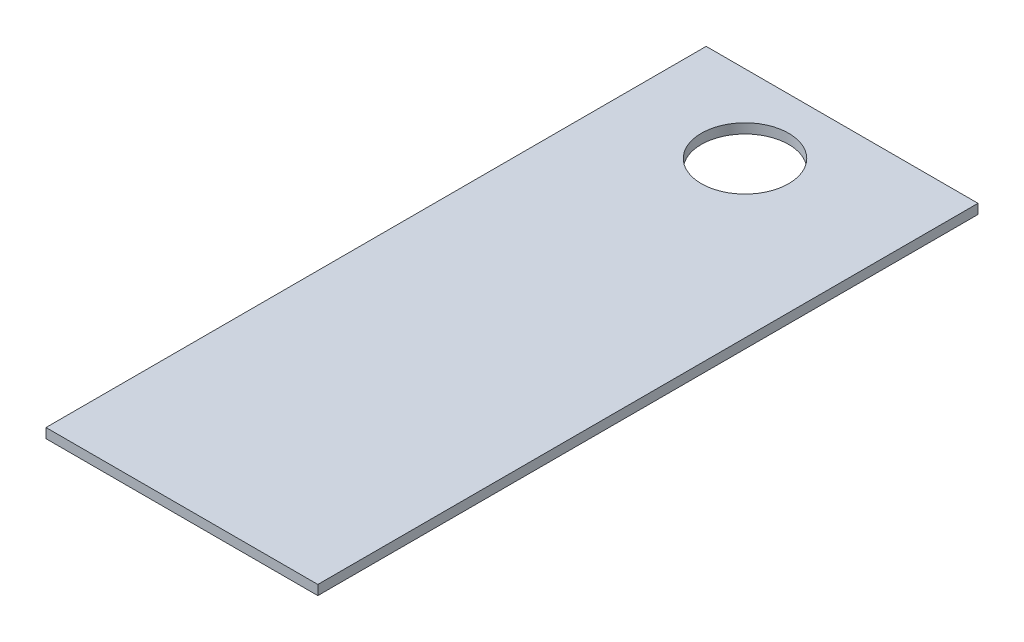
ISO-10303-21;
HEADER;
FILE_DESCRIPTION(('STEP AP214'),'2;1');
FILE_NAME('part.step','',(''),(''),'','','');
FILE_SCHEMA(('AUTOMOTIVE_DESIGN { 1 0 10303 214 1 1 1 1 }'));
ENDSEC;
DATA;
#1=APPLICATION_CONTEXT('core data for automotive mechanical design processes');
#2=APPLICATION_PROTOCOL_DEFINITION('international standard','automotive_design',2000,#1);
#3=PRODUCT_CONTEXT('',#1,'mechanical');
#4=PRODUCT('Part','Part','',(#3));
#5=PRODUCT_RELATED_PRODUCT_CATEGORY('part','',(#4));
#6=PRODUCT_DEFINITION_FORMATION('','',#4);
#7=PRODUCT_DEFINITION_CONTEXT('part definition',#1,'design');
#8=PRODUCT_DEFINITION('design','',#6,#7);
#9=PRODUCT_DEFINITION_SHAPE('','',#8);
#10=(LENGTH_UNIT() NAMED_UNIT(*) SI_UNIT(.MILLI.,.METRE.));
#11=(NAMED_UNIT(*) PLANE_ANGLE_UNIT() SI_UNIT($,.RADIAN.));
#12=(NAMED_UNIT(*) SI_UNIT($,.STERADIAN.) SOLID_ANGLE_UNIT());
#13=UNCERTAINTY_MEASURE_WITH_UNIT(LENGTH_MEASURE(1.E-05),#10,'distance_accuracy_value','');
#14=(GEOMETRIC_REPRESENTATION_CONTEXT(3) GLOBAL_UNCERTAINTY_ASSIGNED_CONTEXT((#13)) GLOBAL_UNIT_ASSIGNED_CONTEXT((#10,
#11,#12)) REPRESENTATION_CONTEXT('',''));
#15=CARTESIAN_POINT('',(0.,0.,0.));
#16=DIRECTION('',(0.,0.,1.));
#17=DIRECTION('',(1.,0.,0.));
#18=AXIS2_PLACEMENT_3D('',#15,#16,#17);
#19=CARTESIAN_POINT('',(0.,3.175,0.));
#20=DIRECTION('',(0.,-1.,0.));
#21=DIRECTION('',(0.,0.,-1.));
#22=AXIS2_PLACEMENT_3D('',#19,#20,#21);
#23=PLANE('',#22);
#24=DIRECTION('',(0.,0.,-1.));
#25=VECTOR('',#24,1.);
#26=CARTESIAN_POINT('',(44.45,3.175,31.75));
#27=LINE('',#26,#25);
#28=CARTESIAN_POINT('',(44.45,3.175,107.95));
#29=VERTEX_POINT('',#28);
#30=CARTESIAN_POINT('',(44.45,3.175,-107.95));
#31=VERTEX_POINT('',#30);
#32=EDGE_CURVE('E54',#29,#31,#27,.T.);
#33=ORIENTED_EDGE('',*,*,#32,.T.);
#34=DIRECTION('',(-1.,0.,0.));
#35=VECTOR('',#34,1.);
#36=CARTESIAN_POINT('',(-44.45,3.175,-107.95));
#37=LINE('',#36,#35);
#38=CARTESIAN_POINT('',(-44.45,3.175,-107.95));
#39=VERTEX_POINT('',#38);
#40=EDGE_CURVE('E85',#31,#39,#37,.T.);
#41=ORIENTED_EDGE('',*,*,#40,.T.);
#42=DIRECTION('',(0.,0.,1.));
#43=VECTOR('',#42,1.);
#44=CARTESIAN_POINT('',(-44.45,3.175,107.95));
#45=LINE('',#44,#43);
#46=CARTESIAN_POINT('',(-44.45,3.175,107.95));
#47=VERTEX_POINT('',#46);
#48=EDGE_CURVE('E89',#39,#47,#45,.T.);
#49=ORIENTED_EDGE('',*,*,#48,.T.);
#50=DIRECTION('',(1.,0.,0.));
#51=VECTOR('',#50,1.);
#52=CARTESIAN_POINT('',(-44.45,3.175,107.95));
#53=LINE('',#52,#51);
#54=EDGE_CURVE('E96',#47,#29,#53,.T.);
#55=ORIENTED_EDGE('',*,*,#54,.T.);
#56=EDGE_LOOP('',(#33,#41,#49,#55));
#57=FACE_BOUND('',#56,.T.);
#58=CARTESIAN_POINT('',(-6.34999999999997,3.175,-82.55));
#59=DIRECTION('',(0.,1.,0.));
#60=DIRECTION('',(0.,0.,1.));
#61=AXIS2_PLACEMENT_3D('',#58,#59,#60);
#62=CIRCLE('',#61,14.2875);
#63=CARTESIAN_POINT('',(-6.34999999999997,3.175,-68.2625));
#64=VERTEX_POINT('',#63);
#65=EDGE_CURVE('E103',#64,#64,#62,.T.);
#66=ORIENTED_EDGE('',*,*,#65,.F.);
#67=EDGE_LOOP('',(#66));
#68=FACE_BOUND('',#67,.T.);
#69=ADVANCED_FACE('F37',(#57,#68),#23,.F.);
#70=CARTESIAN_POINT('',(0.,0.,0.));
#71=DIRECTION('',(0.,-1.,0.));
#72=DIRECTION('',(0.,0.,-1.));
#73=AXIS2_PLACEMENT_3D('',#70,#71,#72);
#74=PLANE('',#73);
#75=DIRECTION('',(-1.,0.,0.));
#76=VECTOR('',#75,1.);
#77=CARTESIAN_POINT('',(-44.45,0.,-107.95));
#78=LINE('',#77,#76);
#79=CARTESIAN_POINT('',(44.45,0.,-107.95));
#80=VERTEX_POINT('',#79);
#81=CARTESIAN_POINT('',(-44.45,0.,-107.95));
#82=VERTEX_POINT('',#81);
#83=EDGE_CURVE('E92',#80,#82,#78,.T.);
#84=ORIENTED_EDGE('',*,*,#83,.F.);
#85=DIRECTION('',(0.,0.,-1.));
#86=VECTOR('',#85,1.);
#87=CARTESIAN_POINT('',(44.45,0.,31.75));
#88=LINE('',#87,#86);
#89=CARTESIAN_POINT('',(44.45,0.,107.95));
#90=VERTEX_POINT('',#89);
#91=EDGE_CURVE('E106',#90,#80,#88,.T.);
#92=ORIENTED_EDGE('',*,*,#91,.F.);
#93=DIRECTION('',(1.,0.,0.));
#94=VECTOR('',#93,1.);
#95=CARTESIAN_POINT('',(-44.45,0.,107.95));
#96=LINE('',#95,#94);
#97=CARTESIAN_POINT('',(-44.45,0.,107.95));
#98=VERTEX_POINT('',#97);
#99=EDGE_CURVE('E79',#98,#90,#96,.T.);
#100=ORIENTED_EDGE('',*,*,#99,.F.);
#101=DIRECTION('',(0.,0.,1.));
#102=VECTOR('',#101,1.);
#103=CARTESIAN_POINT('',(-44.45,0.,107.95));
#104=LINE('',#103,#102);
#105=EDGE_CURVE('E72',#82,#98,#104,.T.);
#106=ORIENTED_EDGE('',*,*,#105,.F.);
#107=EDGE_LOOP('',(#84,#92,#100,#106));
#108=FACE_BOUND('',#107,.T.);
#109=CARTESIAN_POINT('',(-6.34999999999997,0.,-82.55));
#110=DIRECTION('',(0.,1.,0.));
#111=DIRECTION('',(0.,0.,1.));
#112=AXIS2_PLACEMENT_3D('',#109,#110,#111);
#113=CIRCLE('',#112,14.2875);
#114=CARTESIAN_POINT('',(-6.34999999999997,0.,-68.2625));
#115=VERTEX_POINT('',#114);
#116=EDGE_CURVE('E179',#115,#115,#113,.T.);
#117=ORIENTED_EDGE('',*,*,#116,.T.);
#118=EDGE_LOOP('',(#117));
#119=FACE_BOUND('',#118,.T.);
#120=ADVANCED_FACE('F112',(#108,#119),#74,.T.);
#121=CARTESIAN_POINT('',(-44.45,3.175,-107.95));
#122=DIRECTION('',(0.,0.,1.));
#123=DIRECTION('',(1.,0.,0.));
#124=AXIS2_PLACEMENT_3D('',#121,#122,#123);
#125=PLANE('',#124);
#126=ORIENTED_EDGE('',*,*,#83,.T.);
#127=DIRECTION('',(0.,-1.,0.));
#128=VECTOR('',#127,1.);
#129=CARTESIAN_POINT('',(-44.45,3.175,-107.95));
#130=LINE('',#129,#128);
#131=EDGE_CURVE('E46',#39,#82,#130,.T.);
#132=ORIENTED_EDGE('',*,*,#131,.F.);
#133=ORIENTED_EDGE('',*,*,#40,.F.);
#134=DIRECTION('',(0.,-1.,0.));
#135=VECTOR('',#134,1.);
#136=CARTESIAN_POINT('',(44.45,3.175,-107.95));
#137=LINE('',#136,#135);
#138=EDGE_CURVE('E11',#31,#80,#137,.T.);
#139=ORIENTED_EDGE('',*,*,#138,.T.);
#140=EDGE_LOOP('',(#126,#132,#133,#139));
#141=FACE_BOUND('',#140,.T.);
#142=ADVANCED_FACE('F39',(#141),#125,.F.);
#143=CARTESIAN_POINT('',(-44.45,3.175,107.95));
#144=DIRECTION('',(1.,0.,0.));
#145=DIRECTION('',(0.,0.,-1.));
#146=AXIS2_PLACEMENT_3D('',#143,#144,#145);
#147=PLANE('',#146);
#148=ORIENTED_EDGE('',*,*,#105,.T.);
#149=DIRECTION('',(0.,-1.,0.));
#150=VECTOR('',#149,1.);
#151=CARTESIAN_POINT('',(-44.45,3.175,107.95));
#152=LINE('',#151,#150);
#153=EDGE_CURVE('E93',#47,#98,#152,.T.);
#154=ORIENTED_EDGE('',*,*,#153,.F.);
#155=ORIENTED_EDGE('',*,*,#48,.F.);
#156=ORIENTED_EDGE('',*,*,#131,.T.);
#157=EDGE_LOOP('',(#148,#154,#155,#156));
#158=FACE_BOUND('',#157,.T.);
#159=ADVANCED_FACE('F94',(#158),#147,.F.);
#160=CARTESIAN_POINT('',(-44.45,3.175,107.95));
#161=DIRECTION('',(0.,0.,-1.));
#162=DIRECTION('',(-1.,0.,0.));
#163=AXIS2_PLACEMENT_3D('',#160,#161,#162);
#164=PLANE('',#163);
#165=ORIENTED_EDGE('',*,*,#99,.T.);
#166=DIRECTION('',(0.,-1.,0.));
#167=VECTOR('',#166,1.);
#168=CARTESIAN_POINT('',(44.45,3.175,107.95));
#169=LINE('',#168,#167);
#170=EDGE_CURVE('E98',#29,#90,#169,.T.);
#171=ORIENTED_EDGE('',*,*,#170,.F.);
#172=ORIENTED_EDGE('',*,*,#54,.F.);
#173=ORIENTED_EDGE('',*,*,#153,.T.);
#174=EDGE_LOOP('',(#165,#171,#172,#173));
#175=FACE_BOUND('',#174,.T.);
#176=ADVANCED_FACE('F109',(#175),#164,.F.);
#177=CARTESIAN_POINT('',(44.45,3.175,31.75));
#178=DIRECTION('',(-1.,0.,0.));
#179=DIRECTION('',(0.,0.,1.));
#180=AXIS2_PLACEMENT_3D('',#177,#178,#179);
#181=PLANE('',#180);
#182=ORIENTED_EDGE('',*,*,#91,.T.);
#183=ORIENTED_EDGE('',*,*,#138,.F.);
#184=ORIENTED_EDGE('',*,*,#32,.F.);
#185=ORIENTED_EDGE('',*,*,#170,.T.);
#186=EDGE_LOOP('',(#182,#183,#184,#185));
#187=FACE_BOUND('',#186,.T.);
#188=ADVANCED_FACE('F114',(#187),#181,.F.);
#189=CARTESIAN_POINT('',(-6.34999999999997,3.175,-82.55));
#190=DIRECTION('',(0.,-1.,0.));
#191=DIRECTION('',(0.,0.,-1.));
#192=AXIS2_PLACEMENT_3D('',#189,#190,#191);
#193=CYLINDRICAL_SURFACE('',#192,14.2875);
#194=ORIENTED_EDGE('',*,*,#65,.T.);
#195=EDGE_LOOP('',(#194));
#196=FACE_BOUND('',#195,.T.);
#197=ORIENTED_EDGE('',*,*,#116,.F.);
#198=EDGE_LOOP('',(#197));
#199=FACE_BOUND('',#198,.T.);
#200=ADVANCED_FACE('F116',(#196,#199),#193,.F.);
#201=CLOSED_SHELL('',(#69,#120,#142,#159,#176,#188,#200));
#202=MANIFOLD_SOLID_BREP('B2',#201);
#203=ADVANCED_BREP_SHAPE_REPRESENTATION('',(#18,#202),#14);
#204=SHAPE_DEFINITION_REPRESENTATION(#9,#203);
ENDSEC;
END-ISO-10303-21;
